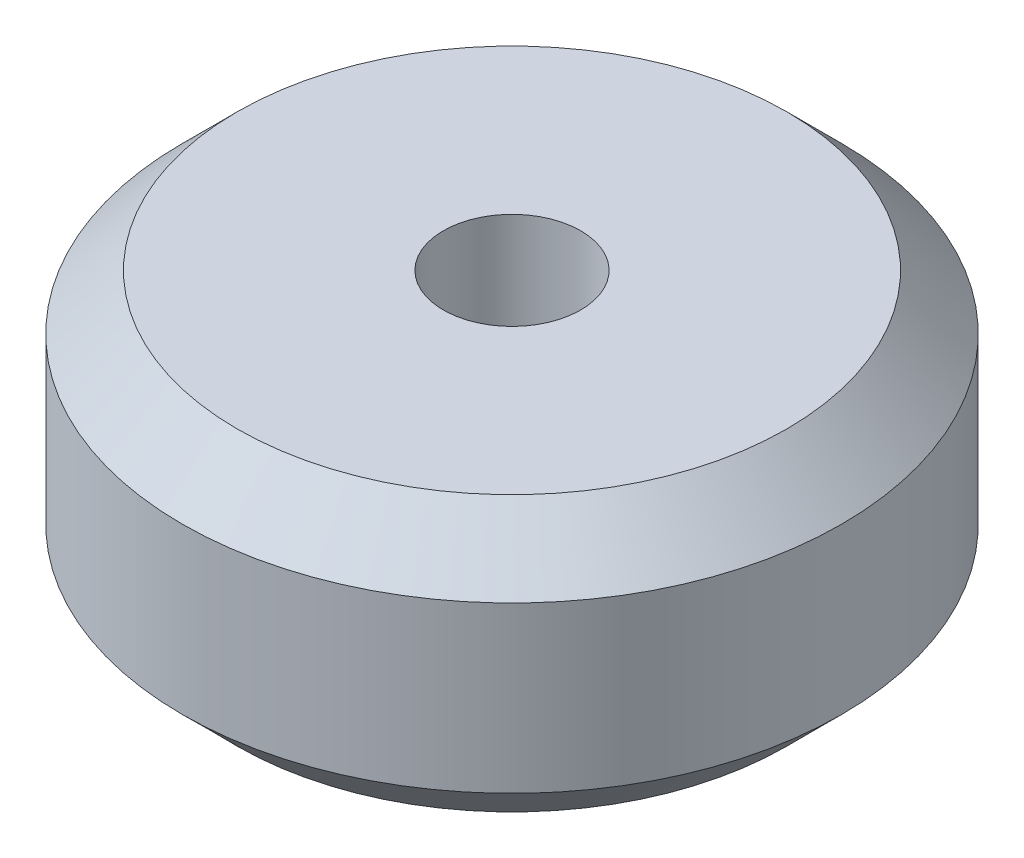
ISO-10303-21;
HEADER;
FILE_DESCRIPTION(('STEP AP214'),'2;1');
FILE_NAME('part.step','',(''),(''),'','','');
FILE_SCHEMA(('AUTOMOTIVE_DESIGN { 1 0 10303 214 1 1 1 1 }'));
ENDSEC;
DATA;
#1=APPLICATION_CONTEXT('core data for automotive mechanical design processes');
#2=APPLICATION_PROTOCOL_DEFINITION('international standard','automotive_design',2000,#1);
#3=PRODUCT_CONTEXT('',#1,'mechanical');
#4=PRODUCT('Part','Part','',(#3));
#5=PRODUCT_RELATED_PRODUCT_CATEGORY('part','',(#4));
#6=PRODUCT_DEFINITION_FORMATION('','',#4);
#7=PRODUCT_DEFINITION_CONTEXT('part definition',#1,'design');
#8=PRODUCT_DEFINITION('design','',#6,#7);
#9=PRODUCT_DEFINITION_SHAPE('','',#8);
#10=(LENGTH_UNIT() NAMED_UNIT(*) SI_UNIT(.MILLI.,.METRE.));
#11=(NAMED_UNIT(*) PLANE_ANGLE_UNIT() SI_UNIT($,.RADIAN.));
#12=(NAMED_UNIT(*) SI_UNIT($,.STERADIAN.) SOLID_ANGLE_UNIT());
#13=UNCERTAINTY_MEASURE_WITH_UNIT(LENGTH_MEASURE(1.E-05),#10,'distance_accuracy_value','');
#14=(GEOMETRIC_REPRESENTATION_CONTEXT(3) GLOBAL_UNCERTAINTY_ASSIGNED_CONTEXT((#13)) GLOBAL_UNIT_ASSIGNED_CONTEXT((#10,
#11,#12)) REPRESENTATION_CONTEXT('',''));
#15=CARTESIAN_POINT('',(0.,0.,0.));
#16=DIRECTION('',(0.,0.,1.));
#17=DIRECTION('',(1.,0.,0.));
#18=AXIS2_PLACEMENT_3D('',#15,#16,#17);
#19=CARTESIAN_POINT('',(0.,8.,0.));
#20=DIRECTION('',(0.,-1.,0.));
#21=DIRECTION('',(0.,0.,-1.));
#22=AXIS2_PLACEMENT_3D('',#19,#20,#21);
#23=CONICAL_SURFACE('',#22,12.,0.785398163397448);
#24=CARTESIAN_POINT('',(0.,10.,0.));
#25=DIRECTION('',(0.,-1.,0.));
#26=DIRECTION('',(0.,0.,-1.));
#27=AXIS2_PLACEMENT_3D('',#24,#25,#26);
#28=CIRCLE('',#27,10.);
#29=CARTESIAN_POINT('',(0.,10.,-10.));
#30=VERTEX_POINT('',#29);
#31=EDGE_CURVE('E62',#30,#30,#28,.T.);
#32=ORIENTED_EDGE('',*,*,#31,.T.);
#33=EDGE_LOOP('',(#32));
#34=FACE_BOUND('',#33,.T.);
#35=CARTESIAN_POINT('',(0.,8.,0.));
#36=DIRECTION('',(0.,-1.,0.));
#37=DIRECTION('',(0.,0.,-1.));
#38=AXIS2_PLACEMENT_3D('',#35,#36,#37);
#39=CIRCLE('',#38,12.);
#40=CARTESIAN_POINT('',(0.,8.,-12.));
#41=VERTEX_POINT('',#40);
#42=EDGE_CURVE('E10',#41,#41,#39,.T.);
#43=ORIENTED_EDGE('',*,*,#42,.F.);
#44=EDGE_LOOP('',(#43));
#45=FACE_BOUND('',#44,.T.);
#46=ADVANCED_FACE('F40',(#34,#45),#23,.T.);
#47=CARTESIAN_POINT('',(0.,0.,0.));
#48=DIRECTION('',(0.,-1.,0.));
#49=DIRECTION('',(0.,0.,-1.));
#50=AXIS2_PLACEMENT_3D('',#47,#48,#49);
#51=CYLINDRICAL_SURFACE('',#50,12.);
#52=ORIENTED_EDGE('',*,*,#42,.T.);
#53=EDGE_LOOP('',(#52));
#54=FACE_BOUND('',#53,.T.);
#55=CARTESIAN_POINT('',(0.,2.,0.));
#56=DIRECTION('',(0.,-1.,0.));
#57=DIRECTION('',(0.,0.,-1.));
#58=AXIS2_PLACEMENT_3D('',#55,#56,#57);
#59=CIRCLE('',#58,12.);
#60=CARTESIAN_POINT('',(0.,2.,-12.));
#61=VERTEX_POINT('',#60);
#62=EDGE_CURVE('E46',#61,#61,#59,.T.);
#63=ORIENTED_EDGE('',*,*,#62,.F.);
#64=EDGE_LOOP('',(#63));
#65=FACE_BOUND('',#64,.T.);
#66=ADVANCED_FACE('F80',(#54,#65),#51,.T.);
#67=CARTESIAN_POINT('',(0.,0.,0.));
#68=DIRECTION('',(0.,1.,0.));
#69=DIRECTION('',(0.,0.,1.));
#70=AXIS2_PLACEMENT_3D('',#67,#68,#69);
#71=CONICAL_SURFACE('',#70,10.,0.785398163397447);
#72=ORIENTED_EDGE('',*,*,#62,.T.);
#73=EDGE_LOOP('',(#72));
#74=FACE_BOUND('',#73,.T.);
#75=CARTESIAN_POINT('',(0.,0.,0.));
#76=DIRECTION('',(0.,-1.,0.));
#77=DIRECTION('',(0.,0.,-1.));
#78=AXIS2_PLACEMENT_3D('',#75,#76,#77);
#79=CIRCLE('',#78,10.);
#80=CARTESIAN_POINT('',(0.,0.,-10.));
#81=VERTEX_POINT('',#80);
#82=EDGE_CURVE('E50',#81,#81,#79,.T.);
#83=ORIENTED_EDGE('',*,*,#82,.F.);
#84=EDGE_LOOP('',(#83));
#85=FACE_BOUND('',#84,.T.);
#86=ADVANCED_FACE('F84',(#74,#85),#71,.T.);
#87=CARTESIAN_POINT('',(0.,0.,-10.));
#88=DIRECTION('',(0.,-1.,0.));
#89=DIRECTION('',(0.,0.,-1.));
#90=AXIS2_PLACEMENT_3D('',#87,#88,#89);
#91=PLANE('',#90);
#92=ORIENTED_EDGE('',*,*,#82,.T.);
#93=EDGE_LOOP('',(#92));
#94=FACE_BOUND('',#93,.T.);
#95=CARTESIAN_POINT('',(0.,0.,0.));
#96=DIRECTION('',(0.,-1.,0.));
#97=DIRECTION('',(0.,0.,-1.));
#98=AXIS2_PLACEMENT_3D('',#95,#96,#97);
#99=CIRCLE('',#98,2.5);
#100=CARTESIAN_POINT('',(0.,0.,-2.5));
#101=VERTEX_POINT('',#100);
#102=EDGE_CURVE('E54',#101,#101,#99,.T.);
#103=ORIENTED_EDGE('',*,*,#102,.F.);
#104=EDGE_LOOP('',(#103));
#105=FACE_BOUND('',#104,.T.);
#106=ADVANCED_FACE('F76',(#94,#105),#91,.T.);
#107=CARTESIAN_POINT('',(0.,0.,0.));
#108=DIRECTION('',(0.,-1.,0.));
#109=DIRECTION('',(0.,0.,-1.));
#110=AXIS2_PLACEMENT_3D('',#107,#108,#109);
#111=CYLINDRICAL_SURFACE('',#110,2.5);
#112=ORIENTED_EDGE('',*,*,#102,.T.);
#113=EDGE_LOOP('',(#112));
#114=FACE_BOUND('',#113,.T.);
#115=CARTESIAN_POINT('',(0.,10.,0.));
#116=DIRECTION('',(0.,-1.,0.));
#117=DIRECTION('',(0.,0.,-1.));
#118=AXIS2_PLACEMENT_3D('',#115,#116,#117);
#119=CIRCLE('',#118,2.5);
#120=CARTESIAN_POINT('',(0.,10.,-2.5));
#121=VERTEX_POINT('',#120);
#122=EDGE_CURVE('E59',#121,#121,#119,.T.);
#123=ORIENTED_EDGE('',*,*,#122,.F.);
#124=EDGE_LOOP('',(#123));
#125=FACE_BOUND('',#124,.T.);
#126=ADVANCED_FACE('F70',(#114,#125),#111,.F.);
#127=CARTESIAN_POINT('',(0.,10.,-2.5));
#128=DIRECTION('',(0.,1.,0.));
#129=DIRECTION('',(0.,0.,1.));
#130=AXIS2_PLACEMENT_3D('',#127,#128,#129);
#131=PLANE('',#130);
#132=ORIENTED_EDGE('',*,*,#122,.T.);
#133=EDGE_LOOP('',(#132));
#134=FACE_BOUND('',#133,.T.);
#135=ORIENTED_EDGE('',*,*,#31,.F.);
#136=EDGE_LOOP('',(#135));
#137=FACE_BOUND('',#136,.T.);
#138=ADVANCED_FACE('F68',(#134,#137),#131,.T.);
#139=CLOSED_SHELL('',(#46,#66,#86,#106,#126,#138));
#140=MANIFOLD_SOLID_BREP('B2',#139);
#141=ADVANCED_BREP_SHAPE_REPRESENTATION('',(#18,#140),#14);
#142=SHAPE_DEFINITION_REPRESENTATION(#9,#141);
ENDSEC;
END-ISO-10303-21;
